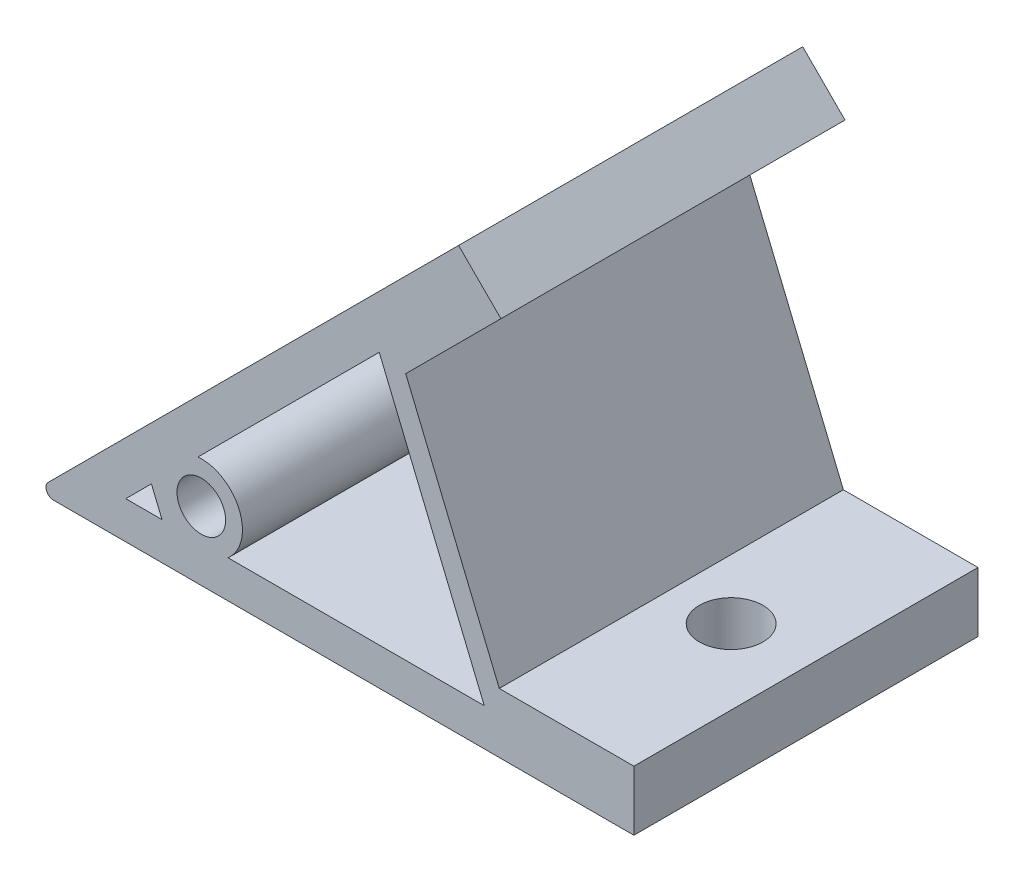
ISO-10303-21;
HEADER;
FILE_DESCRIPTION(('STEP AP214'),'2;1');
FILE_NAME('part.step','',(''),(''),'','','');
FILE_SCHEMA(('AUTOMOTIVE_DESIGN { 1 0 10303 214 1 1 1 1 }'));
ENDSEC;
DATA;
#1=APPLICATION_CONTEXT('core data for automotive mechanical design processes');
#2=APPLICATION_PROTOCOL_DEFINITION('international standard','automotive_design',2000,#1);
#3=PRODUCT_CONTEXT('',#1,'mechanical');
#4=PRODUCT('Part','Part','',(#3));
#5=PRODUCT_RELATED_PRODUCT_CATEGORY('part','',(#4));
#6=PRODUCT_DEFINITION_FORMATION('','',#4);
#7=PRODUCT_DEFINITION_CONTEXT('part definition',#1,'design');
#8=PRODUCT_DEFINITION('design','',#6,#7);
#9=PRODUCT_DEFINITION_SHAPE('','',#8);
#10=(LENGTH_UNIT() NAMED_UNIT(*) SI_UNIT(.MILLI.,.METRE.));
#11=(NAMED_UNIT(*) PLANE_ANGLE_UNIT() SI_UNIT($,.RADIAN.));
#12=(NAMED_UNIT(*) SI_UNIT($,.STERADIAN.) SOLID_ANGLE_UNIT());
#13=UNCERTAINTY_MEASURE_WITH_UNIT(LENGTH_MEASURE(1.E-05),#10,'distance_accuracy_value','');
#14=(GEOMETRIC_REPRESENTATION_CONTEXT(3) GLOBAL_UNCERTAINTY_ASSIGNED_CONTEXT((#13)) GLOBAL_UNIT_ASSIGNED_CONTEXT((#10,
#11,#12)) REPRESENTATION_CONTEXT('',''));
#15=CARTESIAN_POINT('',(0.,0.,0.));
#16=DIRECTION('',(0.,0.,1.));
#17=DIRECTION('',(1.,0.,0.));
#18=AXIS2_PLACEMENT_3D('',#15,#16,#17);
#19=CARTESIAN_POINT('',(-30.4993179415646,38.1869735594505,23.));
#20=DIRECTION('',(-0.707106781186548,0.707106781186547,0.));
#21=DIRECTION('',(-0.707106781186547,-0.707106781186548,0.));
#22=AXIS2_PLACEMENT_3D('',#19,#20,#21);
#23=PLANE('',#22);
#24=DIRECTION('',(0.707106781186547,0.707106781186548,0.));
#25=VECTOR('',#24,1.);
#26=CARTESIAN_POINT('',(-30.4993179415646,38.1869735594505,-23.));
#27=LINE('',#26,#25);
#28=CARTESIAN_POINT('',(-30.4993179415646,38.1869735594505,-23.));
#29=VERTEX_POINT('',#28);
#30=CARTESIAN_POINT('',(-17.7746032555838,50.9116882454314,-23.));
#31=VERTEX_POINT('',#30);
#32=EDGE_CURVE('E236',#29,#31,#27,.T.);
#33=ORIENTED_EDGE('',*,*,#32,.T.);
#34=DIRECTION('',(0.,0.,-1.));
#35=VECTOR('',#34,1.);
#36=CARTESIAN_POINT('',(-17.7746032555838,50.9116882454314,23.));
#37=LINE('',#36,#35);
#38=CARTESIAN_POINT('',(-17.7746032555838,50.9116882454314,23.));
#39=VERTEX_POINT('',#38);
#40=EDGE_CURVE('E246',#39,#31,#37,.T.);
#41=ORIENTED_EDGE('',*,*,#40,.F.);
#42=DIRECTION('',(0.707106781186547,0.707106781186548,0.));
#43=VECTOR('',#42,1.);
#44=CARTESIAN_POINT('',(-30.4993179415646,38.1869735594505,23.));
#45=LINE('',#44,#43);
#46=CARTESIAN_POINT('',(-30.4993179415646,38.1869735594505,23.));
#47=VERTEX_POINT('',#46);
#48=EDGE_CURVE('E219',#47,#39,#45,.T.);
#49=ORIENTED_EDGE('',*,*,#48,.F.);
#50=DIRECTION('',(0.,0.,-1.));
#51=VECTOR('',#50,1.);
#52=CARTESIAN_POINT('',(-30.4993179415646,38.1869735594505,23.));
#53=LINE('',#52,#51);
#54=EDGE_CURVE('E249',#47,#29,#53,.T.);
#55=ORIENTED_EDGE('',*,*,#54,.T.);
#56=EDGE_LOOP('',(#33,#41,#49,#55));
#57=FACE_BOUND('',#56,.T.);
#58=CARTESIAN_POINT('',(-24.8456710674492,43.8406204335659,0.));
#59=DIRECTION('',(-0.70710678118655,0.707106781186545,0.));
#60=DIRECTION('',(-0.707106781186546,-0.707106781186549,0.));
#61=AXIS2_PLACEMENT_3D('',#58,#59,#60);
#62=CIRCLE('',#61,4.25);
#63=CARTESIAN_POINT('',(-27.850874887492,40.8354166135231,0.));
#64=VERTEX_POINT('',#63);
#65=EDGE_CURVE('E305',#64,#64,#62,.T.);
#66=ORIENTED_EDGE('',*,*,#65,.T.);
#67=EDGE_LOOP('',(#66));
#68=FACE_BOUND('',#67,.T.);
#69=ADVANCED_FACE('F35',(#57,#68),#23,.F.);
#70=CARTESIAN_POINT('',(-78.2928932188134,1.7071067811866,23.));
#71=DIRECTION('',(0.707106781186548,-0.707106781186547,0.));
#72=DIRECTION('',(0.707106781186547,0.707106781186548,0.));
#73=AXIS2_PLACEMENT_3D('',#70,#71,#72);
#74=PLANE('',#73);
#75=DIRECTION('',(-0.707106781186547,-0.707106781186548,0.));
#76=VECTOR('',#75,1.);
#77=CARTESIAN_POINT('',(-78.2928932188134,1.7071067811866,-23.));
#78=LINE('',#77,#76);
#79=CARTESIAN_POINT('',(-23.4314575050762,56.5685424949238,-23.));
#80=VERTEX_POINT('',#79);
#81=CARTESIAN_POINT('',(-78.2928932188134,1.7071067811866,-23.));
#82=VERTEX_POINT('',#81);
#83=EDGE_CURVE('E211',#80,#82,#78,.T.);
#84=ORIENTED_EDGE('',*,*,#83,.T.);
#85=DIRECTION('',(0.,0.,-1.));
#86=VECTOR('',#85,1.);
#87=CARTESIAN_POINT('',(-78.2928932188134,1.7071067811866,23.));
#88=LINE('',#87,#86);
#89=CARTESIAN_POINT('',(-78.2928932188134,1.7071067811866,23.));
#90=VERTEX_POINT('',#89);
#91=EDGE_CURVE('E225',#90,#82,#88,.T.);
#92=ORIENTED_EDGE('',*,*,#91,.F.);
#93=DIRECTION('',(-0.707106781186547,-0.707106781186548,0.));
#94=VECTOR('',#93,1.);
#95=CARTESIAN_POINT('',(-78.2928932188134,1.7071067811866,23.));
#96=LINE('',#95,#94);
#97=CARTESIAN_POINT('',(-23.4314575050762,56.5685424949238,23.));
#98=VERTEX_POINT('',#97);
#99=EDGE_CURVE('E223',#98,#90,#96,.T.);
#100=ORIENTED_EDGE('',*,*,#99,.F.);
#101=DIRECTION('',(0.,0.,-1.));
#102=VECTOR('',#101,1.);
#103=CARTESIAN_POINT('',(-23.4314575050762,56.5685424949238,23.));
#104=LINE('',#103,#102);
#105=EDGE_CURVE('E243',#98,#80,#104,.T.);
#106=ORIENTED_EDGE('',*,*,#105,.T.);
#107=EDGE_LOOP('',(#84,#92,#100,#106));
#108=FACE_BOUND('',#107,.T.);
#109=CARTESIAN_POINT('',(-30.5025253169417,49.4974746830583,0.));
#110=DIRECTION('',(0.707106781186548,-0.707106781186547,0.));
#111=DIRECTION('',(0.707106781186547,0.707106781186548,0.));
#112=AXIS2_PLACEMENT_3D('',#109,#110,#111);
#113=CIRCLE('',#112,4.25);
#114=CARTESIAN_POINT('',(-27.4973214968988,52.5026785031012,0.));
#115=VERTEX_POINT('',#114);
#116=EDGE_CURVE('E39',#115,#115,#113,.F.);
#117=ORIENTED_EDGE('',*,*,#116,.F.);
#118=EDGE_LOOP('',(#117));
#119=FACE_BOUND('',#118,.T.);
#120=ADVANCED_FACE('F292',(#108,#119),#74,.F.);
#121=CARTESIAN_POINT('',(-77.5857864376269,1.,23.));
#122=DIRECTION('',(0.,0.,1.));
#123=DIRECTION('',(1.,0.,0.));
#124=AXIS2_PLACEMENT_3D('',#121,#122,#123);
#125=PLANE('',#124);
#126=DIRECTION('',(1.,0.,0.));
#127=VECTOR('',#126,1.);
#128=CARTESIAN_POINT('',(-54.2574687525298,5.,23.));
#129=LINE('',#128,#127);
#130=CARTESIAN_POINT('',(-54.2574687525298,5.,23.));
#131=VERTEX_POINT('',#130);
#132=CARTESIAN_POINT('',(-20.,5.,23.));
#133=VERTEX_POINT('',#132);
#134=EDGE_CURVE('E151',#131,#133,#129,.T.);
#135=ORIENTED_EDGE('',*,*,#134,.F.);
#136=CARTESIAN_POINT('',(-57.8268912197291,9.18440237676214,23.));
#137=DIRECTION('',(0.,0.,-1.));
#138=DIRECTION('',(1.,0.,0.));
#139=AXIS2_PLACEMENT_3D('',#136,#137,#138);
#140=CIRCLE('',#139,5.49999999999996);
#141=CARTESIAN_POINT('',(-58.2617476840749,14.6671845040599,23.));
#142=VERTEX_POINT('',#141);
#143=EDGE_CURVE('E143',#142,#131,#140,.T.);
#144=ORIENTED_EDGE('',*,*,#143,.F.);
#145=DIRECTION('',(-0.707106781186549,-0.707106781186546,0.));
#146=VECTOR('',#145,1.);
#147=CARTESIAN_POINT('',(-58.2617476840749,14.6671845040599,23.));
#148=LINE('',#147,#146);
#149=CARTESIAN_POINT('',(-34.0380592228744,38.8908729652603,23.));
#150=VERTEX_POINT('',#149);
#151=EDGE_CURVE('E167',#150,#142,#148,.T.);
#152=ORIENTED_EDGE('',*,*,#151,.F.);
#153=DIRECTION('',(-0.382683432365087,0.923879532511288,0.));
#154=VECTOR('',#153,1.);
#155=CARTESIAN_POINT('',(-20.,5.,23.));
#156=LINE('',#155,#154);
#157=EDGE_CURVE('E165',#133,#150,#156,.T.);
#158=ORIENTED_EDGE('',*,*,#157,.F.);
#159=EDGE_LOOP('',(#135,#144,#152,#158));
#160=FACE_BOUND('',#159,.T.);
#161=CARTESIAN_POINT('',(-77.5857864376269,1.,23.));
#162=DIRECTION('',(0.,0.,1.));
#163=DIRECTION('',(1.,0.,0.));
#164=AXIS2_PLACEMENT_3D('',#161,#162,#163);
#165=CIRCLE('',#164,1.);
#166=CARTESIAN_POINT('',(-77.5857864376269,0.,23.));
#167=VERTEX_POINT('',#166);
#168=EDGE_CURVE('E207',#90,#167,#165,.T.);
#169=ORIENTED_EDGE('',*,*,#168,.T.);
#170=DIRECTION('',(1.,0.,0.));
#171=VECTOR('',#170,1.);
#172=CARTESIAN_POINT('',(-77.5857864376269,0.,23.));
#173=LINE('',#172,#171);
#174=CARTESIAN_POINT('',(0.,0.,23.));
#175=VERTEX_POINT('',#174);
#176=EDGE_CURVE('E210',#167,#175,#173,.T.);
#177=ORIENTED_EDGE('',*,*,#176,.T.);
#178=DIRECTION('',(0.,1.,0.));
#179=VECTOR('',#178,1.);
#180=CARTESIAN_POINT('',(0.,0.,23.));
#181=LINE('',#180,#179);
#182=CARTESIAN_POINT('',(0.,8.,23.));
#183=VERTEX_POINT('',#182);
#184=EDGE_CURVE('E213',#175,#183,#181,.T.);
#185=ORIENTED_EDGE('',*,*,#184,.T.);
#186=DIRECTION('',(-1.,0.,0.));
#187=VECTOR('',#186,1.);
#188=CARTESIAN_POINT('',(-17.995464086242,8.00000000000012,23.));
#189=LINE('',#188,#187);
#190=CARTESIAN_POINT('',(-17.995464086242,8.00000000000012,23.));
#191=VERTEX_POINT('',#190);
#192=EDGE_CURVE('E215',#183,#191,#189,.T.);
#193=ORIENTED_EDGE('',*,*,#192,.T.);
#194=DIRECTION('',(-0.382683432365096,0.923879532511284,0.));
#195=VECTOR('',#194,1.);
#196=CARTESIAN_POINT('',(-17.995464086242,8.00000000000012,23.));
#197=LINE('',#196,#195);
#198=EDGE_CURVE('E217',#191,#47,#197,.T.);
#199=ORIENTED_EDGE('',*,*,#198,.T.);
#200=ORIENTED_EDGE('',*,*,#48,.T.);
#201=DIRECTION('',(-0.707106781186548,0.707106781186547,0.));
#202=VECTOR('',#201,1.);
#203=CARTESIAN_POINT('',(-17.7746032555838,50.9116882454314,23.));
#204=LINE('',#203,#202);
#205=EDGE_CURVE('E221',#39,#98,#204,.T.);
#206=ORIENTED_EDGE('',*,*,#205,.T.);
#207=ORIENTED_EDGE('',*,*,#99,.T.);
#208=EDGE_LOOP('',(#169,#177,#185,#193,#199,#200,#206,#207));
#209=FACE_BOUND('',#208,.T.);
#210=DIRECTION('',(1.,0.,0.));
#211=VECTOR('',#210,1.);
#212=CARTESIAN_POINT('',(-67.9289321881347,5.,23.));
#213=LINE('',#212,#211);
#214=CARTESIAN_POINT('',(-67.9289321881347,5.,23.));
#215=VERTEX_POINT('',#214);
#216=CARTESIAN_POINT('',(-63.0744704704145,5.00000000000011,23.));
#217=VERTEX_POINT('',#216);
#218=EDGE_CURVE('E185',#215,#217,#213,.T.);
#219=ORIENTED_EDGE('',*,*,#218,.F.);
#220=DIRECTION('',(-0.70710678118656,-0.707106781186535,0.));
#221=VECTOR('',#220,1.);
#222=CARTESIAN_POINT('',(-67.9289321881347,5.,23.));
#223=LINE('',#222,#221);
#224=CARTESIAN_POINT('',(-64.4963093885244,8.43262279961016,23.));
#225=VERTEX_POINT('',#224);
#226=EDGE_CURVE('E183',#225,#215,#223,.T.);
#227=ORIENTED_EDGE('',*,*,#226,.F.);
#228=DIRECTION('',(-0.382683432365157,0.923879532511259,0.));
#229=VECTOR('',#228,1.);
#230=CARTESIAN_POINT('',(-63.0744704704145,5.00000000000011,23.));
#231=LINE('',#230,#229);
#232=EDGE_CURVE('E189',#217,#225,#231,.T.);
#233=ORIENTED_EDGE('',*,*,#232,.F.);
#234=EDGE_LOOP('',(#219,#227,#233));
#235=FACE_BOUND('',#234,.T.);
#236=CARTESIAN_POINT('',(-57.8268912197291,9.18440237676214,23.));
#237=DIRECTION('',(0.,0.,1.));
#238=DIRECTION('',(1.,0.,0.));
#239=AXIS2_PLACEMENT_3D('',#236,#237,#238);
#240=CIRCLE('',#239,3.25);
#241=CARTESIAN_POINT('',(-54.5768912197291,9.18440237676214,23.));
#242=VERTEX_POINT('',#241);
#243=EDGE_CURVE('E173',#242,#242,#240,.T.);
#244=ORIENTED_EDGE('',*,*,#243,.F.);
#245=EDGE_LOOP('',(#244));
#246=FACE_BOUND('',#245,.T.);
#247=ADVANCED_FACE('F163',(#160,#209,#235,#246),#125,.T.);
#248=CARTESIAN_POINT('',(-77.5857864376269,1.,-23.));
#249=DIRECTION('',(0.,0.,1.));
#250=DIRECTION('',(1.,0.,0.));
#251=AXIS2_PLACEMENT_3D('',#248,#249,#250);
#252=PLANE('',#251);
#253=CARTESIAN_POINT('',(-57.8268912197291,9.18440237676214,-23.));
#254=DIRECTION('',(0.,0.,-1.));
#255=DIRECTION('',(1.,0.,0.));
#256=AXIS2_PLACEMENT_3D('',#253,#254,#255);
#257=CIRCLE('',#256,5.49999999999996);
#258=CARTESIAN_POINT('',(-58.2617476840749,14.6671845040599,-23.));
#259=VERTEX_POINT('',#258);
#260=CARTESIAN_POINT('',(-54.2574687525298,5.,-23.));
#261=VERTEX_POINT('',#260);
#262=EDGE_CURVE('E59',#259,#261,#257,.T.);
#263=ORIENTED_EDGE('',*,*,#262,.T.);
#264=DIRECTION('',(1.,0.,0.));
#265=VECTOR('',#264,1.);
#266=CARTESIAN_POINT('',(-54.2574687525298,5.,-23.));
#267=LINE('',#266,#265);
#268=CARTESIAN_POINT('',(-20.,5.,-23.));
#269=VERTEX_POINT('',#268);
#270=EDGE_CURVE('E158',#261,#269,#267,.T.);
#271=ORIENTED_EDGE('',*,*,#270,.T.);
#272=DIRECTION('',(-0.382683432365087,0.923879532511288,0.));
#273=VECTOR('',#272,1.);
#274=CARTESIAN_POINT('',(-20.,5.,-23.));
#275=LINE('',#274,#273);
#276=CARTESIAN_POINT('',(-34.0380592228744,38.8908729652603,-23.));
#277=VERTEX_POINT('',#276);
#278=EDGE_CURVE('E175',#269,#277,#275,.T.);
#279=ORIENTED_EDGE('',*,*,#278,.T.);
#280=DIRECTION('',(-0.707106781186549,-0.707106781186546,0.));
#281=VECTOR('',#280,1.);
#282=CARTESIAN_POINT('',(-58.2617476840749,14.6671845040599,-23.));
#283=LINE('',#282,#281);
#284=EDGE_CURVE('E152',#277,#259,#283,.T.);
#285=ORIENTED_EDGE('',*,*,#284,.T.);
#286=EDGE_LOOP('',(#263,#271,#279,#285));
#287=FACE_BOUND('',#286,.T.);
#288=CARTESIAN_POINT('',(-77.5857864376269,1.,-23.));
#289=DIRECTION('',(0.,0.,1.));
#290=DIRECTION('',(1.,0.,0.));
#291=AXIS2_PLACEMENT_3D('',#288,#289,#290);
#292=CIRCLE('',#291,1.);
#293=CARTESIAN_POINT('',(-77.5857864376269,0.,-23.));
#294=VERTEX_POINT('',#293);
#295=EDGE_CURVE('E206',#82,#294,#292,.T.);
#296=ORIENTED_EDGE('',*,*,#295,.F.);
#297=ORIENTED_EDGE('',*,*,#83,.F.);
#298=DIRECTION('',(-0.707106781186548,0.707106781186547,0.));
#299=VECTOR('',#298,1.);
#300=CARTESIAN_POINT('',(-17.7746032555838,50.9116882454314,-23.));
#301=LINE('',#300,#299);
#302=EDGE_CURVE('E238',#31,#80,#301,.T.);
#303=ORIENTED_EDGE('',*,*,#302,.F.);
#304=ORIENTED_EDGE('',*,*,#32,.F.);
#305=DIRECTION('',(-0.382683432365096,0.923879532511284,0.));
#306=VECTOR('',#305,1.);
#307=CARTESIAN_POINT('',(-17.995464086242,8.00000000000012,-23.));
#308=LINE('',#307,#306);
#309=CARTESIAN_POINT('',(-17.995464086242,8.00000000000012,-23.));
#310=VERTEX_POINT('',#309);
#311=EDGE_CURVE('E234',#310,#29,#308,.T.);
#312=ORIENTED_EDGE('',*,*,#311,.F.);
#313=DIRECTION('',(-1.,0.,0.));
#314=VECTOR('',#313,1.);
#315=CARTESIAN_POINT('',(-17.995464086242,8.00000000000012,-23.));
#316=LINE('',#315,#314);
#317=CARTESIAN_POINT('',(0.,8.,-23.));
#318=VERTEX_POINT('',#317);
#319=EDGE_CURVE('E232',#318,#310,#316,.T.);
#320=ORIENTED_EDGE('',*,*,#319,.F.);
#321=DIRECTION('',(0.,1.,0.));
#322=VECTOR('',#321,1.);
#323=CARTESIAN_POINT('',(0.,0.,-23.));
#324=LINE('',#323,#322);
#325=CARTESIAN_POINT('',(0.,0.,-23.));
#326=VERTEX_POINT('',#325);
#327=EDGE_CURVE('E230',#326,#318,#324,.T.);
#328=ORIENTED_EDGE('',*,*,#327,.F.);
#329=DIRECTION('',(1.,0.,0.));
#330=VECTOR('',#329,1.);
#331=CARTESIAN_POINT('',(-77.5857864376269,0.,-23.));
#332=LINE('',#331,#330);
#333=EDGE_CURVE('E228',#294,#326,#332,.T.);
#334=ORIENTED_EDGE('',*,*,#333,.F.);
#335=EDGE_LOOP('',(#296,#297,#303,#304,#312,#320,#328,#334));
#336=FACE_BOUND('',#335,.T.);
#337=DIRECTION('',(-0.70710678118656,-0.707106781186535,0.));
#338=VECTOR('',#337,1.);
#339=CARTESIAN_POINT('',(-67.9289321881347,5.,-23.));
#340=LINE('',#339,#338);
#341=CARTESIAN_POINT('',(-64.4963093885244,8.43262279961016,-23.));
#342=VERTEX_POINT('',#341);
#343=CARTESIAN_POINT('',(-67.9289321881347,5.,-23.));
#344=VERTEX_POINT('',#343);
#345=EDGE_CURVE('E159',#342,#344,#340,.T.);
#346=ORIENTED_EDGE('',*,*,#345,.T.);
#347=DIRECTION('',(1.,0.,0.));
#348=VECTOR('',#347,1.);
#349=CARTESIAN_POINT('',(-67.9289321881347,5.,-23.));
#350=LINE('',#349,#348);
#351=CARTESIAN_POINT('',(-63.0744704704145,5.00000000000011,-23.));
#352=VERTEX_POINT('',#351);
#353=EDGE_CURVE('E194',#344,#352,#350,.T.);
#354=ORIENTED_EDGE('',*,*,#353,.T.);
#355=DIRECTION('',(-0.382683432365157,0.923879532511259,0.));
#356=VECTOR('',#355,1.);
#357=CARTESIAN_POINT('',(-63.0744704704145,5.00000000000011,-23.));
#358=LINE('',#357,#356);
#359=EDGE_CURVE('E186',#352,#342,#358,.T.);
#360=ORIENTED_EDGE('',*,*,#359,.T.);
#361=EDGE_LOOP('',(#346,#354,#360));
#362=FACE_BOUND('',#361,.T.);
#363=CARTESIAN_POINT('',(-57.8268912197291,9.18440237676214,-23.));
#364=DIRECTION('',(0.,0.,1.));
#365=DIRECTION('',(1.,0.,0.));
#366=AXIS2_PLACEMENT_3D('',#363,#364,#365);
#367=CIRCLE('',#366,3.25);
#368=CARTESIAN_POINT('',(-54.5768912197291,9.18440237676214,-23.));
#369=VERTEX_POINT('',#368);
#370=EDGE_CURVE('E316',#369,#369,#367,.T.);
#371=ORIENTED_EDGE('',*,*,#370,.T.);
#372=EDGE_LOOP('',(#371));
#373=FACE_BOUND('',#372,.T.);
#374=ADVANCED_FACE('F269',(#287,#336,#362,#373),#252,.F.);
#375=CARTESIAN_POINT('',(-77.5857864376269,1.,23.));
#376=DIRECTION('',(0.,0.,-1.));
#377=DIRECTION('',(-1.,0.,0.));
#378=AXIS2_PLACEMENT_3D('',#375,#376,#377);
#379=CYLINDRICAL_SURFACE('',#378,1.);
#380=ORIENTED_EDGE('',*,*,#295,.T.);
#381=DIRECTION('',(0.,0.,-1.));
#382=VECTOR('',#381,1.);
#383=CARTESIAN_POINT('',(-77.5857864376269,0.,23.));
#384=LINE('',#383,#382);
#385=EDGE_CURVE('E11',#167,#294,#384,.T.);
#386=ORIENTED_EDGE('',*,*,#385,.F.);
#387=ORIENTED_EDGE('',*,*,#168,.F.);
#388=ORIENTED_EDGE('',*,*,#91,.T.);
#389=EDGE_LOOP('',(#380,#386,#387,#388));
#390=FACE_BOUND('',#389,.T.);
#391=ADVANCED_FACE('F37',(#390),#379,.T.);
#392=CARTESIAN_POINT('',(-77.5857864376269,0.,23.));
#393=DIRECTION('',(0.,1.,0.));
#394=DIRECTION('',(0.,0.,1.));
#395=AXIS2_PLACEMENT_3D('',#392,#393,#394);
#396=PLANE('',#395);
#397=CARTESIAN_POINT('',(-10.,0.,0.));
#398=DIRECTION('',(0.,1.,0.));
#399=DIRECTION('',(0.,0.,1.));
#400=AXIS2_PLACEMENT_3D('',#397,#398,#399);
#401=CIRCLE('',#400,4.25);
#402=CARTESIAN_POINT('',(-10.,0.,4.25));
#403=VERTEX_POINT('',#402);
#404=EDGE_CURVE('E313',#403,#403,#401,.T.);
#405=ORIENTED_EDGE('',*,*,#404,.T.);
#406=EDGE_LOOP('',(#405));
#407=FACE_BOUND('',#406,.T.);
#408=ORIENTED_EDGE('',*,*,#333,.T.);
#409=DIRECTION('',(0.,0.,-1.));
#410=VECTOR('',#409,1.);
#411=CARTESIAN_POINT('',(0.,0.,23.));
#412=LINE('',#411,#410);
#413=EDGE_CURVE('E44',#175,#326,#412,.T.);
#414=ORIENTED_EDGE('',*,*,#413,.F.);
#415=ORIENTED_EDGE('',*,*,#176,.F.);
#416=ORIENTED_EDGE('',*,*,#385,.T.);
#417=EDGE_LOOP('',(#408,#414,#415,#416));
#418=FACE_BOUND('',#417,.T.);
#419=ADVANCED_FACE('F286',(#407,#418),#396,.F.);
#420=CARTESIAN_POINT('',(0.,0.,23.));
#421=DIRECTION('',(-1.,0.,0.));
#422=DIRECTION('',(0.,0.,1.));
#423=AXIS2_PLACEMENT_3D('',#420,#421,#422);
#424=PLANE('',#423);
#425=ORIENTED_EDGE('',*,*,#327,.T.);
#426=DIRECTION('',(0.,0.,-1.));
#427=VECTOR('',#426,1.);
#428=CARTESIAN_POINT('',(0.,8.,23.));
#429=LINE('',#428,#427);
#430=EDGE_CURVE('E255',#183,#318,#429,.T.);
#431=ORIENTED_EDGE('',*,*,#430,.F.);
#432=ORIENTED_EDGE('',*,*,#184,.F.);
#433=ORIENTED_EDGE('',*,*,#413,.T.);
#434=EDGE_LOOP('',(#425,#431,#432,#433));
#435=FACE_BOUND('',#434,.T.);
#436=ADVANCED_FACE('F263',(#435),#424,.F.);
#437=CARTESIAN_POINT('',(-17.995464086242,8.00000000000012,23.));
#438=DIRECTION('',(0.,-1.,0.));
#439=DIRECTION('',(1.,0.,0.));
#440=AXIS2_PLACEMENT_3D('',#437,#438,#439);
#441=PLANE('',#440);
#442=CARTESIAN_POINT('',(-10.,8.00000000000006,0.));
#443=DIRECTION('',(0.,1.,0.));
#444=DIRECTION('',(-1.,0.,0.));
#445=AXIS2_PLACEMENT_3D('',#442,#443,#444);
#446=CIRCLE('',#445,4.25);
#447=CARTESIAN_POINT('',(-14.25,8.00000000000009,0.));
#448=VERTEX_POINT('',#447);
#449=EDGE_CURVE('E309',#448,#448,#446,.T.);
#450=ORIENTED_EDGE('',*,*,#449,.F.);
#451=EDGE_LOOP('',(#450));
#452=FACE_BOUND('',#451,.T.);
#453=ORIENTED_EDGE('',*,*,#319,.T.);
#454=DIRECTION('',(0.,0.,-1.));
#455=VECTOR('',#454,1.);
#456=CARTESIAN_POINT('',(-17.995464086242,8.00000000000012,23.));
#457=LINE('',#456,#455);
#458=EDGE_CURVE('E252',#191,#310,#457,.T.);
#459=ORIENTED_EDGE('',*,*,#458,.F.);
#460=ORIENTED_EDGE('',*,*,#192,.F.);
#461=ORIENTED_EDGE('',*,*,#430,.T.);
#462=EDGE_LOOP('',(#453,#459,#460,#461));
#463=FACE_BOUND('',#462,.T.);
#464=ADVANCED_FACE('F275',(#452,#463),#441,.F.);
#465=CARTESIAN_POINT('',(-17.995464086242,8.00000000000012,23.));
#466=DIRECTION('',(-0.923879532511284,-0.382683432365096,0.));
#467=DIRECTION('',(0.382683432365096,-0.923879532511284,0.));
#468=AXIS2_PLACEMENT_3D('',#465,#466,#467);
#469=PLANE('',#468);
#470=ORIENTED_EDGE('',*,*,#311,.T.);
#471=ORIENTED_EDGE('',*,*,#54,.F.);
#472=ORIENTED_EDGE('',*,*,#198,.F.);
#473=ORIENTED_EDGE('',*,*,#458,.T.);
#474=EDGE_LOOP('',(#470,#471,#472,#473));
#475=FACE_BOUND('',#474,.T.);
#476=ADVANCED_FACE('F279',(#475),#469,.F.);
#477=CARTESIAN_POINT('',(-17.7746032555838,50.9116882454314,23.));
#478=DIRECTION('',(-0.707106781186547,-0.707106781186548,0.));
#479=DIRECTION('',(0.707106781186548,-0.707106781186547,0.));
#480=AXIS2_PLACEMENT_3D('',#477,#478,#479);
#481=PLANE('',#480);
#482=ORIENTED_EDGE('',*,*,#302,.T.);
#483=ORIENTED_EDGE('',*,*,#105,.F.);
#484=ORIENTED_EDGE('',*,*,#205,.F.);
#485=ORIENTED_EDGE('',*,*,#40,.T.);
#486=EDGE_LOOP('',(#482,#483,#484,#485));
#487=FACE_BOUND('',#486,.T.);
#488=ADVANCED_FACE('F298',(#487),#481,.F.);
#489=CARTESIAN_POINT('',(-67.9289321881347,5.,23.));
#490=DIRECTION('',(0.707106781186535,-0.70710678118656,0.));
#491=DIRECTION('',(0.70710678118656,0.707106781186535,0.));
#492=AXIS2_PLACEMENT_3D('',#489,#490,#491);
#493=PLANE('',#492);
#494=ORIENTED_EDGE('',*,*,#345,.F.);
#495=DIRECTION('',(0.,0.,-1.));
#496=VECTOR('',#495,1.);
#497=CARTESIAN_POINT('',(-64.4963093885244,8.43262279961016,23.));
#498=LINE('',#497,#496);
#499=EDGE_CURVE('E191',#225,#342,#498,.T.);
#500=ORIENTED_EDGE('',*,*,#499,.F.);
#501=ORIENTED_EDGE('',*,*,#226,.T.);
#502=DIRECTION('',(0.,0.,-1.));
#503=VECTOR('',#502,1.);
#504=CARTESIAN_POINT('',(-67.9289321881347,5.,23.));
#505=LINE('',#504,#503);
#506=EDGE_CURVE('E203',#215,#344,#505,.T.);
#507=ORIENTED_EDGE('',*,*,#506,.T.);
#508=EDGE_LOOP('',(#494,#500,#501,#507));
#509=FACE_BOUND('',#508,.T.);
#510=ADVANCED_FACE('F353',(#509),#493,.T.);
#511=CARTESIAN_POINT('',(-67.9289321881347,5.,23.));
#512=DIRECTION('',(0.,1.,0.));
#513=DIRECTION('',(-1.,0.,0.));
#514=AXIS2_PLACEMENT_3D('',#511,#512,#513);
#515=PLANE('',#514);
#516=ORIENTED_EDGE('',*,*,#353,.F.);
#517=ORIENTED_EDGE('',*,*,#506,.F.);
#518=ORIENTED_EDGE('',*,*,#218,.T.);
#519=DIRECTION('',(0.,0.,-1.));
#520=VECTOR('',#519,1.);
#521=CARTESIAN_POINT('',(-63.0744704704145,5.00000000000011,23.));
#522=LINE('',#521,#520);
#523=EDGE_CURVE('E201',#217,#352,#522,.T.);
#524=ORIENTED_EDGE('',*,*,#523,.T.);
#525=EDGE_LOOP('',(#516,#517,#518,#524));
#526=FACE_BOUND('',#525,.T.);
#527=ADVANCED_FACE('F349',(#526),#515,.T.);
#528=CARTESIAN_POINT('',(-63.0744704704145,5.00000000000011,23.));
#529=DIRECTION('',(-0.923879532511259,-0.382683432365157,0.));
#530=DIRECTION('',(0.382683432365157,-0.923879532511259,0.));
#531=AXIS2_PLACEMENT_3D('',#528,#529,#530);
#532=PLANE('',#531);
#533=ORIENTED_EDGE('',*,*,#359,.F.);
#534=ORIENTED_EDGE('',*,*,#523,.F.);
#535=ORIENTED_EDGE('',*,*,#232,.T.);
#536=ORIENTED_EDGE('',*,*,#499,.T.);
#537=EDGE_LOOP('',(#533,#534,#535,#536));
#538=FACE_BOUND('',#537,.T.);
#539=ADVANCED_FACE('F346',(#538),#532,.T.);
#540=CARTESIAN_POINT('',(-57.8268912197291,9.18440237676214,23.));
#541=DIRECTION('',(0.,0.,-1.));
#542=DIRECTION('',(-1.,0.,0.));
#543=AXIS2_PLACEMENT_3D('',#540,#541,#542);
#544=CYLINDRICAL_SURFACE('',#543,5.49999999999996);
#545=ORIENTED_EDGE('',*,*,#262,.F.);
#546=DIRECTION('',(0.,0.,-1.));
#547=VECTOR('',#546,1.);
#548=CARTESIAN_POINT('',(-58.2617476840749,14.6671845040599,23.));
#549=LINE('',#548,#547);
#550=EDGE_CURVE('E147',#142,#259,#549,.T.);
#551=ORIENTED_EDGE('',*,*,#550,.F.);
#552=ORIENTED_EDGE('',*,*,#143,.T.);
#553=DIRECTION('',(0.,0.,-1.));
#554=VECTOR('',#553,1.);
#555=CARTESIAN_POINT('',(-54.2574687525298,5.,23.));
#556=LINE('',#555,#554);
#557=EDGE_CURVE('E146',#131,#261,#556,.T.);
#558=ORIENTED_EDGE('',*,*,#557,.T.);
#559=EDGE_LOOP('',(#545,#551,#552,#558));
#560=FACE_BOUND('',#559,.T.);
#561=ADVANCED_FACE('F145',(#560),#544,.T.);
#562=CARTESIAN_POINT('',(-54.2574687525298,5.,23.));
#563=DIRECTION('',(0.,1.,0.));
#564=DIRECTION('',(0.,0.,1.));
#565=AXIS2_PLACEMENT_3D('',#562,#563,#564);
#566=PLANE('',#565);
#567=ORIENTED_EDGE('',*,*,#270,.F.);
#568=ORIENTED_EDGE('',*,*,#557,.F.);
#569=ORIENTED_EDGE('',*,*,#134,.T.);
#570=DIRECTION('',(0.,0.,-1.));
#571=VECTOR('',#570,1.);
#572=CARTESIAN_POINT('',(-20.,5.,23.));
#573=LINE('',#572,#571);
#574=EDGE_CURVE('E160',#133,#269,#573,.T.);
#575=ORIENTED_EDGE('',*,*,#574,.T.);
#576=EDGE_LOOP('',(#567,#568,#569,#575));
#577=FACE_BOUND('',#576,.T.);
#578=ADVANCED_FACE('F155',(#577),#566,.T.);
#579=CARTESIAN_POINT('',(-20.,5.,23.));
#580=DIRECTION('',(-0.923879532511288,-0.382683432365087,0.));
#581=DIRECTION('',(0.382683432365087,-0.923879532511288,0.));
#582=AXIS2_PLACEMENT_3D('',#579,#580,#581);
#583=PLANE('',#582);
#584=ORIENTED_EDGE('',*,*,#278,.F.);
#585=ORIENTED_EDGE('',*,*,#574,.F.);
#586=ORIENTED_EDGE('',*,*,#157,.T.);
#587=DIRECTION('',(0.,0.,-1.));
#588=VECTOR('',#587,1.);
#589=CARTESIAN_POINT('',(-34.0380592228744,38.8908729652603,23.));
#590=LINE('',#589,#588);
#591=EDGE_CURVE('E51',#150,#277,#590,.T.);
#592=ORIENTED_EDGE('',*,*,#591,.T.);
#593=EDGE_LOOP('',(#584,#585,#586,#592));
#594=FACE_BOUND('',#593,.T.);
#595=ADVANCED_FACE('F335',(#594),#583,.T.);
#596=CARTESIAN_POINT('',(-58.2617476840749,14.6671845040599,23.));
#597=DIRECTION('',(0.707106781186546,-0.707106781186549,0.));
#598=DIRECTION('',(0.707106781186549,0.707106781186546,0.));
#599=AXIS2_PLACEMENT_3D('',#596,#597,#598);
#600=PLANE('',#599);
#601=ORIENTED_EDGE('',*,*,#284,.F.);
#602=ORIENTED_EDGE('',*,*,#591,.F.);
#603=ORIENTED_EDGE('',*,*,#151,.T.);
#604=ORIENTED_EDGE('',*,*,#550,.T.);
#605=EDGE_LOOP('',(#601,#602,#603,#604));
#606=FACE_BOUND('',#605,.T.);
#607=ADVANCED_FACE('F325',(#606),#600,.T.);
#608=CARTESIAN_POINT('',(-57.8268912197291,9.18440237676214,23.));
#609=DIRECTION('',(0.,0.,-1.));
#610=DIRECTION('',(-1.,0.,0.));
#611=AXIS2_PLACEMENT_3D('',#608,#609,#610);
#612=CYLINDRICAL_SURFACE('',#611,3.25);
#613=ORIENTED_EDGE('',*,*,#243,.T.);
#614=EDGE_LOOP('',(#613));
#615=FACE_BOUND('',#614,.T.);
#616=ORIENTED_EDGE('',*,*,#370,.F.);
#617=EDGE_LOOP('',(#616));
#618=FACE_BOUND('',#617,.T.);
#619=ADVANCED_FACE('F322',(#615,#618),#612,.F.);
#620=CARTESIAN_POINT('',(-10.0000000000001,-8.99999999999994,0.));
#621=DIRECTION('',(0.,1.,0.));
#622=DIRECTION('',(-1.,0.,0.));
#623=AXIS2_PLACEMENT_3D('',#620,#621,#622);
#624=CYLINDRICAL_SURFACE('',#623,4.25);
#625=ORIENTED_EDGE('',*,*,#449,.T.);
#626=EDGE_LOOP('',(#625));
#627=FACE_BOUND('',#626,.T.);
#628=ORIENTED_EDGE('',*,*,#404,.F.);
#629=EDGE_LOOP('',(#628));
#630=FACE_BOUND('',#629,.T.);
#631=ADVANCED_FACE('F324',(#627,#630),#624,.F.);
#632=CARTESIAN_POINT('',(-36.8664863476205,55.8614357137372,0.));
#633=DIRECTION('',(0.70710678118655,-0.707106781186545,0.));
#634=DIRECTION('',(0.707106781186545,0.70710678118655,0.));
#635=AXIS2_PLACEMENT_3D('',#632,#633,#634);
#636=CYLINDRICAL_SURFACE('',#635,4.25);
#637=ORIENTED_EDGE('',*,*,#65,.F.);
#638=EDGE_LOOP('',(#637));
#639=FACE_BOUND('',#638,.T.);
#640=ORIENTED_EDGE('',*,*,#116,.T.);
#641=EDGE_LOOP('',(#640));
#642=FACE_BOUND('',#641,.T.);
#643=ADVANCED_FACE('F332',(#639,#642),#636,.F.);
#644=CLOSED_SHELL('',(#69,#120,#247,#374,#391,#419,#436,#464,#476,#488,#510,#527,#539,#561,#578,
#595,#607,#619,#631,#643));
#645=MANIFOLD_SOLID_BREP('B2',#644);
#646=ADVANCED_BREP_SHAPE_REPRESENTATION('',(#18,#645),#14);
#647=SHAPE_DEFINITION_REPRESENTATION(#9,#646);
ENDSEC;
END-ISO-10303-21;
